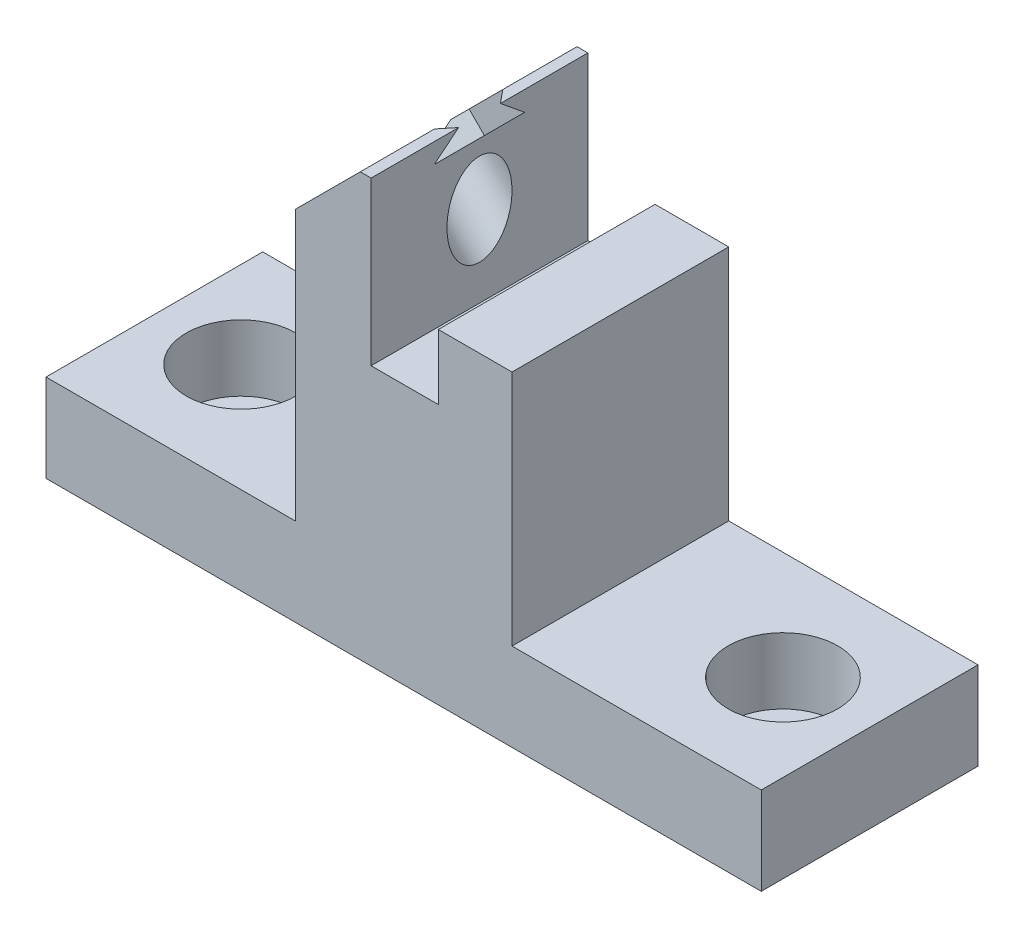
ISO-10303-21;
HEADER;
FILE_DESCRIPTION(('STEP AP214'),'2;1');
FILE_NAME('part.step','',(''),(''),'','','');
FILE_SCHEMA(('AUTOMOTIVE_DESIGN { 1 0 10303 214 1 1 1 1 }'));
ENDSEC;
DATA;
#1=APPLICATION_CONTEXT('core data for automotive mechanical design processes');
#2=APPLICATION_PROTOCOL_DEFINITION('international standard','automotive_design',2000,#1);
#3=PRODUCT_CONTEXT('',#1,'mechanical');
#4=PRODUCT('Part','Part','',(#3));
#5=PRODUCT_RELATED_PRODUCT_CATEGORY('part','',(#4));
#6=PRODUCT_DEFINITION_FORMATION('','',#4);
#7=PRODUCT_DEFINITION_CONTEXT('part definition',#1,'design');
#8=PRODUCT_DEFINITION('design','',#6,#7);
#9=PRODUCT_DEFINITION_SHAPE('','',#8);
#10=(LENGTH_UNIT() NAMED_UNIT(*) SI_UNIT(.MILLI.,.METRE.));
#11=(NAMED_UNIT(*) PLANE_ANGLE_UNIT() SI_UNIT($,.RADIAN.));
#12=(NAMED_UNIT(*) SI_UNIT($,.STERADIAN.) SOLID_ANGLE_UNIT());
#13=UNCERTAINTY_MEASURE_WITH_UNIT(LENGTH_MEASURE(1.E-05),#10,'distance_accuracy_value','');
#14=(GEOMETRIC_REPRESENTATION_CONTEXT(3) GLOBAL_UNCERTAINTY_ASSIGNED_CONTEXT((#13)) GLOBAL_UNIT_ASSIGNED_CONTEXT((#10,
#11,#12)) REPRESENTATION_CONTEXT('',''));
#15=CARTESIAN_POINT('',(0.,0.,0.));
#16=DIRECTION('',(0.,0.,1.));
#17=DIRECTION('',(1.,0.,0.));
#18=AXIS2_PLACEMENT_3D('',#15,#16,#17);
#19=CARTESIAN_POINT('',(-25.,21.001,0.));
#20=DIRECTION('',(0.,-1.,0.));
#21=DIRECTION('',(0.,0.,-1.));
#22=AXIS2_PLACEMENT_3D('',#19,#20,#21);
#23=CYLINDRICAL_SURFACE('',#22,3.);
#24=CARTESIAN_POINT('',(-25.,-18.,0.));
#25=DIRECTION('',(0.,1.,0.));
#26=DIRECTION('',(0.,0.,-1.));
#27=AXIS2_PLACEMENT_3D('',#24,#25,#26);
#28=CIRCLE('',#27,3.);
#29=CARTESIAN_POINT('',(-25.,-18.,-3.));
#30=VERTEX_POINT('',#29);
#31=EDGE_CURVE('E225',#30,#30,#28,.T.);
#32=ORIENTED_EDGE('',*,*,#31,.F.);
#33=EDGE_LOOP('',(#32));
#34=FACE_BOUND('',#33,.T.);
#35=CARTESIAN_POINT('',(-25.,-16.,0.));
#36=DIRECTION('',(0.,1.,0.));
#37=DIRECTION('',(0.,0.,1.));
#38=AXIS2_PLACEMENT_3D('',#35,#36,#37);
#39=CIRCLE('',#38,3.);
#40=CARTESIAN_POINT('',(-25.,-16.,3.));
#41=VERTEX_POINT('',#40);
#42=EDGE_CURVE('E43',#41,#41,#39,.T.);
#43=ORIENTED_EDGE('',*,*,#42,.T.);
#44=EDGE_LOOP('',(#43));
#45=FACE_BOUND('',#44,.T.);
#46=ADVANCED_FACE('F39',(#34,#45),#23,.F.);
#47=CARTESIAN_POINT('',(25.,21.001,0.));
#48=DIRECTION('',(0.,-1.,0.));
#49=DIRECTION('',(0.,0.,-1.));
#50=AXIS2_PLACEMENT_3D('',#47,#48,#49);
#51=CYLINDRICAL_SURFACE('',#50,3.);
#52=CARTESIAN_POINT('',(25.,-18.,0.));
#53=DIRECTION('',(0.,-1.,0.));
#54=DIRECTION('',(0.,0.,-1.));
#55=AXIS2_PLACEMENT_3D('',#52,#53,#54);
#56=CIRCLE('',#55,3.);
#57=CARTESIAN_POINT('',(25.,-18.,-3.));
#58=VERTEX_POINT('',#57);
#59=EDGE_CURVE('E236',#58,#58,#56,.T.);
#60=ORIENTED_EDGE('',*,*,#59,.T.);
#61=EDGE_LOOP('',(#60));
#62=FACE_BOUND('',#61,.T.);
#63=CARTESIAN_POINT('',(25.,-16.,0.));
#64=DIRECTION('',(0.,1.,0.));
#65=DIRECTION('',(0.,0.,1.));
#66=AXIS2_PLACEMENT_3D('',#63,#64,#65);
#67=CIRCLE('',#66,3.);
#68=CARTESIAN_POINT('',(25.,-16.,3.));
#69=VERTEX_POINT('',#68);
#70=EDGE_CURVE('E232',#69,#69,#67,.F.);
#71=ORIENTED_EDGE('',*,*,#70,.F.);
#72=EDGE_LOOP('',(#71));
#73=FACE_BOUND('',#72,.T.);
#74=ADVANCED_FACE('F450',(#62,#73),#51,.F.);
#75=CARTESIAN_POINT('',(10.,6.,10.));
#76=DIRECTION('',(-1.,0.,0.));
#77=DIRECTION('',(0.,0.,1.));
#78=AXIS2_PLACEMENT_3D('',#75,#76,#77);
#79=PLANE('',#78);
#80=DIRECTION('',(0.,0.,1.));
#81=VECTOR('',#80,1.);
#82=CARTESIAN_POINT('',(10.,-9.9,10.));
#83=LINE('',#82,#81);
#84=CARTESIAN_POINT('',(10.,-9.9,-10.));
#85=VERTEX_POINT('',#84);
#86=CARTESIAN_POINT('',(10.,-9.9,10.));
#87=VERTEX_POINT('',#86);
#88=EDGE_CURVE('E65',#85,#87,#83,.T.);
#89=ORIENTED_EDGE('',*,*,#88,.F.);
#90=DIRECTION('',(0.,-1.,0.));
#91=VECTOR('',#90,1.);
#92=CARTESIAN_POINT('',(10.,6.,-10.));
#93=LINE('',#92,#91);
#94=CARTESIAN_POINT('',(10.,12.,-10.));
#95=VERTEX_POINT('',#94);
#96=EDGE_CURVE('E427',#95,#85,#93,.T.);
#97=ORIENTED_EDGE('',*,*,#96,.F.);
#98=DIRECTION('',(0.,0.,-1.));
#99=VECTOR('',#98,1.);
#100=CARTESIAN_POINT('',(10.,12.,10.));
#101=LINE('',#100,#99);
#102=CARTESIAN_POINT('',(10.,12.,10.));
#103=VERTEX_POINT('',#102);
#104=EDGE_CURVE('E394',#103,#95,#101,.T.);
#105=ORIENTED_EDGE('',*,*,#104,.F.);
#106=DIRECTION('',(0.,-1.,0.));
#107=VECTOR('',#106,1.);
#108=CARTESIAN_POINT('',(10.,6.,10.));
#109=LINE('',#108,#107);
#110=EDGE_CURVE('E418',#103,#87,#109,.T.);
#111=ORIENTED_EDGE('',*,*,#110,.T.);
#112=EDGE_LOOP('',(#89,#97,#105,#111));
#113=FACE_BOUND('',#112,.T.);
#114=ADVANCED_FACE('F452',(#113),#79,.F.);
#115=CARTESIAN_POINT('',(0.,21.,0.));
#116=DIRECTION('',(0.,-1.,0.));
#117=DIRECTION('',(0.,0.,-1.));
#118=AXIS2_PLACEMENT_3D('',#115,#116,#117);
#119=PLANE('',#118);
#120=DIRECTION('',(0.,0.,-1.));
#121=VECTOR('',#120,1.);
#122=CARTESIAN_POINT('',(-3.,21.,10.));
#123=LINE('',#122,#121);
#124=CARTESIAN_POINT('',(-3.,21.,10.));
#125=VERTEX_POINT('',#124);
#126=CARTESIAN_POINT('',(-3.,21.,1.92808109443833));
#127=VERTEX_POINT('',#126);
#128=EDGE_CURVE('E366',#125,#127,#123,.T.);
#129=ORIENTED_EDGE('',*,*,#128,.T.);
#130=DIRECTION('',(-0.632455532033677,0.,0.774596669241483));
#131=VECTOR('',#130,1.);
#132=CARTESIAN_POINT('',(-0.85543702718383,21.,-0.698461407894577));
#133=LINE('',#132,#131);
#134=CARTESIAN_POINT('',(-4.00000000000001,21.,3.15282596582992));
#135=VERTEX_POINT('',#134);
#136=EDGE_CURVE('E343',#127,#135,#133,.T.);
#137=ORIENTED_EDGE('',*,*,#136,.T.);
#138=DIRECTION('',(0.,0.,1.));
#139=VECTOR('',#138,1.);
#140=CARTESIAN_POINT('',(-4.00000000000001,21.,0.));
#141=LINE('',#140,#139);
#142=CARTESIAN_POINT('',(-4.00000000000001,21.,10.));
#143=VERTEX_POINT('',#142);
#144=EDGE_CURVE('E430',#135,#143,#141,.T.);
#145=ORIENTED_EDGE('',*,*,#144,.T.);
#146=DIRECTION('',(1.,0.,0.));
#147=VECTOR('',#146,1.);
#148=CARTESIAN_POINT('',(-10.,21.,10.));
#149=LINE('',#148,#147);
#150=EDGE_CURVE('E362',#143,#125,#149,.T.);
#151=ORIENTED_EDGE('',*,*,#150,.T.);
#152=EDGE_LOOP('',(#129,#137,#145,#151));
#153=FACE_BOUND('',#152,.T.);
#154=ADVANCED_FACE('F459',(#153),#119,.F.);
#155=CARTESIAN_POINT('',(-4.00000000000001,21.,0.));
#156=DIRECTION('',(0.707106781186549,-0.707106781186546,0.));
#157=DIRECTION('',(0.,0.,1.));
#158=AXIS2_PLACEMENT_3D('',#155,#156,#157);
#159=PLANE('',#158);
#160=DIRECTION('',(0.353553390593273,0.353553390593274,-0.866025403784439));
#161=VECTOR('',#160,1.);
#162=CARTESIAN_POINT('',(-4.97864220139431,20.0213577986057,5.55));
#163=LINE('',#162,#161);
#164=CARTESIAN_POINT('',(-4.97864220139431,20.0213577986057,5.55));
#165=VERTEX_POINT('',#164);
#166=EDGE_CURVE('E264',#165,#135,#163,.T.);
#167=ORIENTED_EDGE('',*,*,#166,.F.);
#168=DIRECTION('',(0.707106781186546,0.707106781186549,0.));
#169=VECTOR('',#168,1.);
#170=CARTESIAN_POINT('',(-9.51019822554318,15.4898017744568,5.55));
#171=LINE('',#170,#169);
#172=CARTESIAN_POINT('',(-9.51019822554318,15.4898017744568,5.55));
#173=VERTEX_POINT('',#172);
#174=EDGE_CURVE('E270',#173,#165,#171,.T.);
#175=ORIENTED_EDGE('',*,*,#174,.F.);
#176=DIRECTION('',(0.353553390593273,0.353553390593274,0.866025403784439));
#177=VECTOR('',#176,1.);
#178=CARTESIAN_POINT('',(-11.7759762376176,13.2240237623824,0.));
#179=LINE('',#178,#177);
#180=CARTESIAN_POINT('',(-10.,15.,4.350235577471));
#181=VERTEX_POINT('',#180);
#182=EDGE_CURVE('E301',#181,#173,#179,.T.);
#183=ORIENTED_EDGE('',*,*,#182,.F.);
#184=DIRECTION('',(0.,0.,-1.));
#185=VECTOR('',#184,1.);
#186=CARTESIAN_POINT('',(-10.,15.,10.));
#187=LINE('',#186,#185);
#188=CARTESIAN_POINT('',(-10.,15.,10.));
#189=VERTEX_POINT('',#188);
#190=EDGE_CURVE('E49',#189,#181,#187,.T.);
#191=ORIENTED_EDGE('',*,*,#190,.F.);
#192=DIRECTION('',(0.707106781186546,0.707106781186549,0.));
#193=VECTOR('',#192,1.);
#194=CARTESIAN_POINT('',(-4.00000000000001,21.,10.));
#195=LINE('',#194,#193);
#196=EDGE_CURVE('E435',#143,#189,#195,.F.);
#197=ORIENTED_EDGE('',*,*,#196,.F.);
#198=ORIENTED_EDGE('',*,*,#144,.F.);
#199=EDGE_LOOP('',(#167,#175,#183,#191,#197,#198));
#200=FACE_BOUND('',#199,.T.);
#201=ADVANCED_FACE('F510',(#200),#159,.F.);
#202=CARTESIAN_POINT('',(-0.173352401603255,10.6845119746658,0.));
#203=DIRECTION('',(-0.707106781186549,0.707106781186546,0.));
#204=DIRECTION('',(-0.707106781186546,-0.707106781186549,0.));
#205=AXIS2_PLACEMENT_3D('',#202,#203,#204);
#206=CYLINDRICAL_SURFACE('',#205,3.);
#207=CARTESIAN_POINT('',(-3.,13.5111595730625,0.));
#208=DIRECTION('',(-1.,0.,0.));
#209=DIRECTION('',(0.,1.,0.));
#210=AXIS2_PLACEMENT_3D('',#207,#208,#209);
#211=ELLIPSE('',#210,4.24264068711928,3.);
#212=CARTESIAN_POINT('',(-3.,17.7538002601818,0.));
#213=VERTEX_POINT('',#212);
#214=EDGE_CURVE('E357',#213,#213,#211,.T.);
#215=ORIENTED_EDGE('',*,*,#214,.F.);
#216=EDGE_LOOP('',(#215));
#217=FACE_BOUND('',#216,.T.);
#218=CARTESIAN_POINT('',(-5.83020665109565,16.3413662241582,0.));
#219=DIRECTION('',(-0.707106781186549,0.707106781186546,0.));
#220=DIRECTION('',(-0.707106781186546,-0.707106781186549,0.));
#221=AXIS2_PLACEMENT_3D('',#218,#219,#220);
#222=CIRCLE('',#221,3.);
#223=CARTESIAN_POINT('',(-7.95152699465529,14.2200458805985,0.));
#224=VERTEX_POINT('',#223);
#225=EDGE_CURVE('E310',#224,#224,#222,.F.);
#226=ORIENTED_EDGE('',*,*,#225,.F.);
#227=EDGE_LOOP('',(#226));
#228=FACE_BOUND('',#227,.T.);
#229=ADVANCED_FACE('F506',(#217,#228),#206,.F.);
#230=CARTESIAN_POINT('',(0.,6.,0.));
#231=DIRECTION('',(0.,-1.,0.));
#232=DIRECTION('',(0.,0.,-1.));
#233=AXIS2_PLACEMENT_3D('',#230,#231,#232);
#234=PLANE('',#233);
#235=DIRECTION('',(0.,0.,-1.));
#236=VECTOR('',#235,1.);
#237=CARTESIAN_POINT('',(-3.,6.,10.));
#238=LINE('',#237,#236);
#239=CARTESIAN_POINT('',(-3.,6.,10.));
#240=VERTEX_POINT('',#239);
#241=CARTESIAN_POINT('',(-3.,6.,-10.));
#242=VERTEX_POINT('',#241);
#243=EDGE_CURVE('E361',#240,#242,#238,.T.);
#244=ORIENTED_EDGE('',*,*,#243,.F.);
#245=DIRECTION('',(1.,0.,0.));
#246=VECTOR('',#245,1.);
#247=CARTESIAN_POINT('',(-10.,6.,10.));
#248=LINE('',#247,#246);
#249=CARTESIAN_POINT('',(3.2,6.,10.));
#250=VERTEX_POINT('',#249);
#251=EDGE_CURVE('E415',#240,#250,#248,.T.);
#252=ORIENTED_EDGE('',*,*,#251,.T.);
#253=DIRECTION('',(0.,0.,1.));
#254=VECTOR('',#253,1.);
#255=CARTESIAN_POINT('',(3.2,6.,10.));
#256=LINE('',#255,#254);
#257=CARTESIAN_POINT('',(3.2,6.,-10.));
#258=VERTEX_POINT('',#257);
#259=EDGE_CURVE('E385',#258,#250,#256,.T.);
#260=ORIENTED_EDGE('',*,*,#259,.F.);
#261=DIRECTION('',(-1.,0.,0.));
#262=VECTOR('',#261,1.);
#263=CARTESIAN_POINT('',(-10.,6.,-10.));
#264=LINE('',#263,#262);
#265=EDGE_CURVE('E412',#258,#242,#264,.T.);
#266=ORIENTED_EDGE('',*,*,#265,.T.);
#267=EDGE_LOOP('',(#244,#252,#260,#266));
#268=FACE_BOUND('',#267,.T.);
#269=ADVANCED_FACE('F509',(#268),#234,.F.);
#270=CARTESIAN_POINT('',(-10.,6.,-10.));
#271=DIRECTION('',(0.,0.,1.));
#272=DIRECTION('',(1.,0.,0.));
#273=AXIS2_PLACEMENT_3D('',#270,#271,#272);
#274=PLANE('',#273);
#275=DIRECTION('',(0.,-1.,0.));
#276=VECTOR('',#275,1.);
#277=CARTESIAN_POINT('',(-10.,6.,-10.));
#278=LINE('',#277,#276);
#279=CARTESIAN_POINT('',(-10.,15.,-10.));
#280=VERTEX_POINT('',#279);
#281=CARTESIAN_POINT('',(-10.,-9.9,-10.));
#282=VERTEX_POINT('',#281);
#283=EDGE_CURVE('E423',#280,#282,#278,.T.);
#284=ORIENTED_EDGE('',*,*,#283,.F.);
#285=DIRECTION('',(-0.707106781186546,-0.707106781186549,0.));
#286=VECTOR('',#285,1.);
#287=CARTESIAN_POINT('',(-4.00000000000001,21.,-10.));
#288=LINE('',#287,#286);
#289=CARTESIAN_POINT('',(-4.00000000000001,21.,-10.));
#290=VERTEX_POINT('',#289);
#291=EDGE_CURVE('E11',#280,#290,#288,.F.);
#292=ORIENTED_EDGE('',*,*,#291,.T.);
#293=DIRECTION('',(-1.,0.,0.));
#294=VECTOR('',#293,1.);
#295=CARTESIAN_POINT('',(-10.,21.,-10.));
#296=LINE('',#295,#294);
#297=CARTESIAN_POINT('',(-3.,21.,-10.));
#298=VERTEX_POINT('',#297);
#299=EDGE_CURVE('E370',#298,#290,#296,.T.);
#300=ORIENTED_EDGE('',*,*,#299,.F.);
#301=DIRECTION('',(0.,-1.,0.));
#302=VECTOR('',#301,1.);
#303=CARTESIAN_POINT('',(-3.,21.,-10.));
#304=LINE('',#303,#302);
#305=EDGE_CURVE('E374',#298,#242,#304,.T.);
#306=ORIENTED_EDGE('',*,*,#305,.T.);
#307=ORIENTED_EDGE('',*,*,#265,.F.);
#308=DIRECTION('',(0.,-1.,0.));
#309=VECTOR('',#308,1.);
#310=CARTESIAN_POINT('',(3.2,12.,-10.));
#311=LINE('',#310,#309);
#312=CARTESIAN_POINT('',(3.2,12.,-10.));
#313=VERTEX_POINT('',#312);
#314=EDGE_CURVE('E401',#313,#258,#311,.T.);
#315=ORIENTED_EDGE('',*,*,#314,.F.);
#316=DIRECTION('',(-1.,0.,0.));
#317=VECTOR('',#316,1.);
#318=CARTESIAN_POINT('',(3.2,12.,-10.));
#319=LINE('',#318,#317);
#320=EDGE_CURVE('E398',#95,#313,#319,.T.);
#321=ORIENTED_EDGE('',*,*,#320,.F.);
#322=ORIENTED_EDGE('',*,*,#96,.T.);
#323=DIRECTION('',(-1.,0.,0.));
#324=VECTOR('',#323,1.);
#325=CARTESIAN_POINT('',(33.,-9.9,-10.));
#326=LINE('',#325,#324);
#327=CARTESIAN_POINT('',(33.,-9.9,-10.));
#328=VERTEX_POINT('',#327);
#329=EDGE_CURVE('E260',#328,#85,#326,.T.);
#330=ORIENTED_EDGE('',*,*,#329,.F.);
#331=DIRECTION('',(0.,1.,0.));
#332=VECTOR('',#331,1.);
#333=CARTESIAN_POINT('',(33.,-18.,-10.));
#334=LINE('',#333,#332);
#335=CARTESIAN_POINT('',(33.,-18.,-10.));
#336=VERTEX_POINT('',#335);
#337=EDGE_CURVE('E248',#336,#328,#334,.T.);
#338=ORIENTED_EDGE('',*,*,#337,.F.);
#339=DIRECTION('',(1.,0.,0.));
#340=VECTOR('',#339,1.);
#341=CARTESIAN_POINT('',(10.,-18.,-10.));
#342=LINE('',#341,#340);
#343=CARTESIAN_POINT('',(-33.,-18.,-10.));
#344=VERTEX_POINT('',#343);
#345=EDGE_CURVE('E351',#344,#336,#342,.T.);
#346=ORIENTED_EDGE('',*,*,#345,.F.);
#347=DIRECTION('',(0.,1.,0.));
#348=VECTOR('',#347,1.);
#349=CARTESIAN_POINT('',(-33.,-18.,-10.));
#350=LINE('',#349,#348);
#351=CARTESIAN_POINT('',(-33.,-9.9,-10.));
#352=VERTEX_POINT('',#351);
#353=EDGE_CURVE('E215',#344,#352,#350,.T.);
#354=ORIENTED_EDGE('',*,*,#353,.T.);
#355=DIRECTION('',(1.,0.,0.));
#356=VECTOR('',#355,1.);
#357=CARTESIAN_POINT('',(-33.,-9.9,-10.));
#358=LINE('',#357,#356);
#359=EDGE_CURVE('E200',#352,#282,#358,.T.);
#360=ORIENTED_EDGE('',*,*,#359,.T.);
#361=EDGE_LOOP('',(#284,#292,#300,#306,#307,#315,#321,#322,#330,#338,#346,#354,#360));
#362=FACE_BOUND('',#361,.T.);
#363=ADVANCED_FACE('F530',(#362),#274,.F.);
#364=CARTESIAN_POINT('',(-10.,6.,10.));
#365=DIRECTION('',(1.,0.,0.));
#366=DIRECTION('',(0.,0.,-1.));
#367=AXIS2_PLACEMENT_3D('',#364,#365,#366);
#368=PLANE('',#367);
#369=ORIENTED_EDGE('',*,*,#283,.T.);
#370=DIRECTION('',(0.,0.,1.));
#371=VECTOR('',#370,1.);
#372=CARTESIAN_POINT('',(-10.,-9.9,10.));
#373=LINE('',#372,#371);
#374=CARTESIAN_POINT('',(-10.,-9.9,10.));
#375=VERTEX_POINT('',#374);
#376=EDGE_CURVE('E211',#282,#375,#373,.T.);
#377=ORIENTED_EDGE('',*,*,#376,.T.);
#378=DIRECTION('',(0.,-1.,0.));
#379=VECTOR('',#378,1.);
#380=CARTESIAN_POINT('',(-10.,6.,10.));
#381=LINE('',#380,#379);
#382=EDGE_CURVE('E197',#189,#375,#381,.T.);
#383=ORIENTED_EDGE('',*,*,#382,.F.);
#384=ORIENTED_EDGE('',*,*,#190,.T.);
#385=DIRECTION('',(0.,-0.632455532033675,-0.774596669241484));
#386=VECTOR('',#385,1.);
#387=CARTESIAN_POINT('',(-10.,14.1678080004252,3.33101269397869));
#388=LINE('',#387,#386);
#389=CARTESIAN_POINT('',(-10.,12.1715728752538,0.886133962333245));
#390=VERTEX_POINT('',#389);
#391=EDGE_CURVE('E339',#181,#390,#388,.T.);
#392=ORIENTED_EDGE('',*,*,#391,.T.);
#393=DIRECTION('',(0.,0.,1.));
#394=VECTOR('',#393,1.);
#395=CARTESIAN_POINT('',(-10.,12.1715728752538,10.));
#396=LINE('',#395,#394);
#397=CARTESIAN_POINT('',(-10.,12.1715728752538,-0.886133962333247));
#398=VERTEX_POINT('',#397);
#399=EDGE_CURVE('E324',#398,#390,#396,.T.);
#400=ORIENTED_EDGE('',*,*,#399,.F.);
#401=DIRECTION('',(0.,0.632455532033675,-0.774596669241484));
#402=VECTOR('',#401,1.);
#403=CARTESIAN_POINT('',(-10.,4.36984902929251,8.66898730602132));
#404=LINE('',#403,#402);
#405=CARTESIAN_POINT('',(-10.,15.,-4.350235577471));
#406=VERTEX_POINT('',#405);
#407=EDGE_CURVE('E335',#398,#406,#404,.T.);
#408=ORIENTED_EDGE('',*,*,#407,.T.);
#409=EDGE_CURVE('E438',#406,#280,#187,.T.);
#410=ORIENTED_EDGE('',*,*,#409,.T.);
#411=EDGE_LOOP('',(#369,#377,#383,#384,#392,#400,#408,#410));
#412=FACE_BOUND('',#411,.T.);
#413=ADVANCED_FACE('F534',(#412),#368,.F.);
#414=CARTESIAN_POINT('',(-10.,6.,10.));
#415=DIRECTION('',(0.,0.,-1.));
#416=DIRECTION('',(-1.,0.,0.));
#417=AXIS2_PLACEMENT_3D('',#414,#415,#416);
#418=PLANE('',#417);
#419=ORIENTED_EDGE('',*,*,#150,.F.);
#420=ORIENTED_EDGE('',*,*,#196,.T.);
#421=ORIENTED_EDGE('',*,*,#382,.T.);
#422=DIRECTION('',(1.,0.,0.));
#423=VECTOR('',#422,1.);
#424=CARTESIAN_POINT('',(-33.,-9.9,10.));
#425=LINE('',#424,#423);
#426=CARTESIAN_POINT('',(-33.,-9.9,10.));
#427=VERTEX_POINT('',#426);
#428=EDGE_CURVE('E57',#427,#375,#425,.T.);
#429=ORIENTED_EDGE('',*,*,#428,.F.);
#430=DIRECTION('',(0.,-1.,0.));
#431=VECTOR('',#430,1.);
#432=CARTESIAN_POINT('',(-33.,-18.,10.));
#433=LINE('',#432,#431);
#434=CARTESIAN_POINT('',(-33.,-18.,10.));
#435=VERTEX_POINT('',#434);
#436=EDGE_CURVE('E194',#427,#435,#433,.T.);
#437=ORIENTED_EDGE('',*,*,#436,.T.);
#438=DIRECTION('',(-1.,0.,0.));
#439=VECTOR('',#438,1.);
#440=CARTESIAN_POINT('',(10.,-18.,10.));
#441=LINE('',#440,#439);
#442=CARTESIAN_POINT('',(33.,-18.,10.));
#443=VERTEX_POINT('',#442);
#444=EDGE_CURVE('E354',#443,#435,#441,.T.);
#445=ORIENTED_EDGE('',*,*,#444,.F.);
#446=DIRECTION('',(0.,-1.,0.));
#447=VECTOR('',#446,1.);
#448=CARTESIAN_POINT('',(33.,-18.,10.));
#449=LINE('',#448,#447);
#450=CARTESIAN_POINT('',(33.,-9.9,10.));
#451=VERTEX_POINT('',#450);
#452=EDGE_CURVE('E240',#451,#443,#449,.T.);
#453=ORIENTED_EDGE('',*,*,#452,.F.);
#454=DIRECTION('',(-1.,0.,0.));
#455=VECTOR('',#454,1.);
#456=CARTESIAN_POINT('',(33.,-9.9,10.));
#457=LINE('',#456,#455);
#458=EDGE_CURVE('E254',#451,#87,#457,.T.);
#459=ORIENTED_EDGE('',*,*,#458,.T.);
#460=ORIENTED_EDGE('',*,*,#110,.F.);
#461=DIRECTION('',(1.,0.,0.));
#462=VECTOR('',#461,1.);
#463=CARTESIAN_POINT('',(3.2,12.,10.));
#464=LINE('',#463,#462);
#465=CARTESIAN_POINT('',(3.2,12.,10.));
#466=VERTEX_POINT('',#465);
#467=EDGE_CURVE('E390',#466,#103,#464,.T.);
#468=ORIENTED_EDGE('',*,*,#467,.F.);
#469=DIRECTION('',(0.,-1.,0.));
#470=VECTOR('',#469,1.);
#471=CARTESIAN_POINT('',(3.2,12.,10.));
#472=LINE('',#471,#470);
#473=EDGE_CURVE('E408',#466,#250,#472,.T.);
#474=ORIENTED_EDGE('',*,*,#473,.T.);
#475=ORIENTED_EDGE('',*,*,#251,.F.);
#476=DIRECTION('',(0.,-1.,0.));
#477=VECTOR('',#476,1.);
#478=CARTESIAN_POINT('',(-3.,21.,10.));
#479=LINE('',#478,#477);
#480=EDGE_CURVE('E381',#125,#240,#479,.T.);
#481=ORIENTED_EDGE('',*,*,#480,.F.);
#482=EDGE_LOOP('',(#419,#420,#421,#429,#437,#445,#453,#459,#460,#468,#474,#475,#481));
#483=FACE_BOUND('',#482,.T.);
#484=ADVANCED_FACE('F193',(#483),#418,.F.);
#485=CARTESIAN_POINT('',(3.2,12.,10.));
#486=DIRECTION('',(1.,0.,0.));
#487=DIRECTION('',(0.,0.,-1.));
#488=AXIS2_PLACEMENT_3D('',#485,#486,#487);
#489=PLANE('',#488);
#490=ORIENTED_EDGE('',*,*,#259,.T.);
#491=ORIENTED_EDGE('',*,*,#473,.F.);
#492=DIRECTION('',(0.,0.,1.));
#493=VECTOR('',#492,1.);
#494=CARTESIAN_POINT('',(3.2,12.,10.));
#495=LINE('',#494,#493);
#496=EDGE_CURVE('E386',#313,#466,#495,.T.);
#497=ORIENTED_EDGE('',*,*,#496,.F.);
#498=ORIENTED_EDGE('',*,*,#314,.T.);
#499=EDGE_LOOP('',(#490,#491,#497,#498));
#500=FACE_BOUND('',#499,.T.);
#501=ADVANCED_FACE('F523',(#500),#489,.F.);
#502=CARTESIAN_POINT('',(0.,12.,0.));
#503=DIRECTION('',(0.,-1.,0.));
#504=DIRECTION('',(0.,0.,-1.));
#505=AXIS2_PLACEMENT_3D('',#502,#503,#504);
#506=PLANE('',#505);
#507=ORIENTED_EDGE('',*,*,#496,.T.);
#508=ORIENTED_EDGE('',*,*,#467,.T.);
#509=ORIENTED_EDGE('',*,*,#104,.T.);
#510=ORIENTED_EDGE('',*,*,#320,.T.);
#511=EDGE_LOOP('',(#507,#508,#509,#510));
#512=FACE_BOUND('',#511,.T.);
#513=ADVANCED_FACE('F519',(#512),#506,.F.);
#514=CARTESIAN_POINT('',(-3.,21.,10.));
#515=DIRECTION('',(-1.,0.,0.));
#516=DIRECTION('',(0.,0.,1.));
#517=AXIS2_PLACEMENT_3D('',#514,#515,#516);
#518=PLANE('',#517);
#519=ORIENTED_EDGE('',*,*,#214,.T.);
#520=EDGE_LOOP('',(#519));
#521=FACE_BOUND('',#520,.T.);
#522=DIRECTION('',(0.,0.,-1.));
#523=VECTOR('',#522,1.);
#524=CARTESIAN_POINT('',(-3.,19.1715728752538,10.));
#525=LINE('',#524,#523);
#526=CARTESIAN_POINT('',(-3.,19.1715728752538,4.16743783818448));
#527=VERTEX_POINT('',#526);
#528=CARTESIAN_POINT('',(-3.,19.1715728752538,-4.16743783818448));
#529=VERTEX_POINT('',#528);
#530=EDGE_CURVE('E321',#527,#529,#525,.T.);
#531=ORIENTED_EDGE('',*,*,#530,.F.);
#532=DIRECTION('',(0.,0.632455532033675,-0.774596669241484));
#533=VECTOR('',#532,1.);
#534=CARTESIAN_POINT('',(-3.,17.0455834872498,6.77123243777534));
#535=LINE('',#534,#533);
#536=EDGE_CURVE('E347',#527,#127,#535,.T.);
#537=ORIENTED_EDGE('',*,*,#536,.T.);
#538=ORIENTED_EDGE('',*,*,#128,.F.);
#539=ORIENTED_EDGE('',*,*,#480,.T.);
#540=ORIENTED_EDGE('',*,*,#243,.T.);
#541=ORIENTED_EDGE('',*,*,#305,.F.);
#542=CARTESIAN_POINT('',(-3.,21.,-1.92808109443833));
#543=VERTEX_POINT('',#542);
#544=EDGE_CURVE('E365',#543,#298,#123,.T.);
#545=ORIENTED_EDGE('',*,*,#544,.F.);
#546=DIRECTION('',(0.,-0.632455532033676,-0.774596669241484));
#547=VECTOR('',#546,1.);
#548=CARTESIAN_POINT('',(-3.,26.8435424583825,5.22876756222467));
#549=LINE('',#548,#547);
#550=EDGE_CURVE('E331',#543,#529,#549,.T.);
#551=ORIENTED_EDGE('',*,*,#550,.T.);
#552=EDGE_LOOP('',(#531,#537,#538,#539,#540,#541,#545,#551));
#553=FACE_BOUND('',#552,.T.);
#554=ADVANCED_FACE('F515',(#521,#553),#518,.F.);
#555=CARTESIAN_POINT('',(-4.00000000000001,21.,-3.15282596582992));
#556=VERTEX_POINT('',#555);
#557=EDGE_CURVE('E431',#290,#556,#141,.T.);
#558=ORIENTED_EDGE('',*,*,#557,.T.);
#559=DIRECTION('',(0.632455532033677,0.,0.774596669241483));
#560=VECTOR('',#559,1.);
#561=CARTESIAN_POINT('',(-0.855437027183828,21.,0.698461407894576));
#562=LINE('',#561,#560);
#563=EDGE_CURVE('E327',#556,#543,#562,.T.);
#564=ORIENTED_EDGE('',*,*,#563,.T.);
#565=ORIENTED_EDGE('',*,*,#544,.T.);
#566=ORIENTED_EDGE('',*,*,#299,.T.);
#567=EDGE_LOOP('',(#558,#564,#565,#566));
#568=FACE_BOUND('',#567,.T.);
#569=ADVANCED_FACE('F512',(#568),#119,.F.);
#570=DIRECTION('',(-0.353553390593273,-0.353553390593274,0.866025403784439));
#571=VECTOR('',#570,1.);
#572=CARTESIAN_POINT('',(-9.51019822554318,15.4898017744568,-5.55));
#573=LINE('',#572,#571);
#574=CARTESIAN_POINT('',(-9.51019822554318,15.4898017744568,-5.55));
#575=VERTEX_POINT('',#574);
#576=EDGE_CURVE('E298',#575,#406,#573,.T.);
#577=ORIENTED_EDGE('',*,*,#576,.F.);
#578=DIRECTION('',(-0.707106781186546,-0.707106781186549,0.));
#579=VECTOR('',#578,1.);
#580=CARTESIAN_POINT('',(-4.97864220139431,20.0213577986057,-5.55));
#581=LINE('',#580,#579);
#582=CARTESIAN_POINT('',(-4.97864220139431,20.0213577986057,-5.55));
#583=VERTEX_POINT('',#582);
#584=EDGE_CURVE('E294',#583,#575,#581,.T.);
#585=ORIENTED_EDGE('',*,*,#584,.F.);
#586=DIRECTION('',(-0.353553390593273,-0.353553390593275,-0.866025403784439));
#587=VECTOR('',#586,1.);
#588=CARTESIAN_POINT('',(-2.71286418931987,22.2871358106801,0.));
#589=LINE('',#588,#587);
#590=EDGE_CURVE('E291',#556,#583,#589,.T.);
#591=ORIENTED_EDGE('',*,*,#590,.F.);
#592=ORIENTED_EDGE('',*,*,#557,.F.);
#593=ORIENTED_EDGE('',*,*,#291,.F.);
#594=ORIENTED_EDGE('',*,*,#409,.F.);
#595=EDGE_LOOP('',(#577,#585,#591,#592,#593,#594));
#596=FACE_BOUND('',#595,.T.);
#597=ADVANCED_FACE('F41',(#596),#159,.F.);
#598=CARTESIAN_POINT('',(0.,-18.,0.));
#599=DIRECTION('',(0.,-1.,0.));
#600=DIRECTION('',(0.,0.,-1.));
#601=AXIS2_PLACEMENT_3D('',#598,#599,#600);
#602=PLANE('',#601);
#603=ORIENTED_EDGE('',*,*,#31,.T.);
#604=EDGE_LOOP('',(#603));
#605=FACE_BOUND('',#604,.T.);
#606=ORIENTED_EDGE('',*,*,#59,.F.);
#607=EDGE_LOOP('',(#606));
#608=FACE_BOUND('',#607,.T.);
#609=ORIENTED_EDGE('',*,*,#444,.T.);
#610=DIRECTION('',(0.,0.,-1.));
#611=VECTOR('',#610,1.);
#612=CARTESIAN_POINT('',(-33.,-18.,10.));
#613=LINE('',#612,#611);
#614=EDGE_CURVE('E209',#435,#344,#613,.T.);
#615=ORIENTED_EDGE('',*,*,#614,.T.);
#616=ORIENTED_EDGE('',*,*,#345,.T.);
#617=DIRECTION('',(0.,0.,-1.));
#618=VECTOR('',#617,1.);
#619=CARTESIAN_POINT('',(33.,-18.,10.));
#620=LINE('',#619,#618);
#621=EDGE_CURVE('E244',#443,#336,#620,.T.);
#622=ORIENTED_EDGE('',*,*,#621,.F.);
#623=EDGE_LOOP('',(#609,#615,#616,#622));
#624=FACE_BOUND('',#623,.T.);
#625=ADVANCED_FACE('F501',(#605,#608,#624),#602,.T.);
#626=CARTESIAN_POINT('',(-3.56442863902121,18.6071442362326,5.55));
#627=DIRECTION('',(0.612372435695793,0.612372435695796,0.5));
#628=DIRECTION('',(-0.707106781186549,0.707106781186546,0.));
#629=AXIS2_PLACEMENT_3D('',#626,#627,#628);
#630=PLANE('',#629);
#631=DIRECTION('',(0.353553390593273,0.353553390593274,-0.866025403784439));
#632=VECTOR('',#631,1.);
#633=CARTESIAN_POINT('',(-3.56442863902121,18.6071442362326,5.55));
#634=LINE('',#633,#632);
#635=CARTESIAN_POINT('',(-3.56442863902121,18.6071442362326,5.55));
#636=VERTEX_POINT('',#635);
#637=EDGE_CURVE('E265',#636,#527,#634,.T.);
#638=ORIENTED_EDGE('',*,*,#637,.F.);
#639=DIRECTION('',(-0.707106781186549,0.707106781186546,0.));
#640=VECTOR('',#639,1.);
#641=CARTESIAN_POINT('',(-3.56442863902121,18.6071442362326,5.55));
#642=LINE('',#641,#640);
#643=EDGE_CURVE('E307',#636,#165,#642,.T.);
#644=ORIENTED_EDGE('',*,*,#643,.T.);
#645=ORIENTED_EDGE('',*,*,#166,.T.);
#646=ORIENTED_EDGE('',*,*,#136,.F.);
#647=ORIENTED_EDGE('',*,*,#536,.F.);
#648=EDGE_LOOP('',(#638,#644,#645,#646,#647));
#649=FACE_BOUND('',#648,.T.);
#650=ADVANCED_FACE('F488',(#649),#630,.F.);
#651=CARTESIAN_POINT('',(-10.3617626752445,11.8098102000093,0.));
#652=DIRECTION('',(-0.612372435695793,-0.612372435695796,0.5));
#653=DIRECTION('',(0.707106781186549,-0.707106781186546,0.));
#654=AXIS2_PLACEMENT_3D('',#651,#652,#653);
#655=PLANE('',#654);
#656=ORIENTED_EDGE('',*,*,#182,.T.);
#657=DIRECTION('',(-0.707106781186549,0.707106781186546,0.));
#658=VECTOR('',#657,1.);
#659=CARTESIAN_POINT('',(-8.09598466317008,14.0755882120837,5.55));
#660=LINE('',#659,#658);
#661=CARTESIAN_POINT('',(-8.09598466317008,14.0755882120837,5.55));
#662=VERTEX_POINT('',#661);
#663=EDGE_CURVE('E311',#662,#173,#660,.T.);
#664=ORIENTED_EDGE('',*,*,#663,.F.);
#665=DIRECTION('',(0.353553390593273,0.353553390593274,0.866025403784439));
#666=VECTOR('',#665,1.);
#667=CARTESIAN_POINT('',(-10.3617626752445,11.8098102000093,0.));
#668=LINE('',#667,#666);
#669=EDGE_CURVE('E281',#390,#662,#668,.T.);
#670=ORIENTED_EDGE('',*,*,#669,.F.);
#671=ORIENTED_EDGE('',*,*,#391,.F.);
#672=EDGE_LOOP('',(#656,#664,#670,#671));
#673=FACE_BOUND('',#672,.T.);
#674=ADVANCED_FACE('F484',(#673),#655,.F.);
#675=CARTESIAN_POINT('',(-8.09598466317008,14.0755882120837,-5.55));
#676=DIRECTION('',(-0.612372435695793,-0.612372435695796,-0.5));
#677=DIRECTION('',(0.707106781186549,-0.707106781186546,0.));
#678=AXIS2_PLACEMENT_3D('',#675,#676,#677);
#679=PLANE('',#678);
#680=DIRECTION('',(-0.353553390593273,-0.353553390593274,0.866025403784439));
#681=VECTOR('',#680,1.);
#682=CARTESIAN_POINT('',(-8.09598466317008,14.0755882120837,-5.55));
#683=LINE('',#682,#681);
#684=CARTESIAN_POINT('',(-8.09598466317008,14.0755882120837,-5.55));
#685=VERTEX_POINT('',#684);
#686=EDGE_CURVE('E277',#685,#398,#683,.T.);
#687=ORIENTED_EDGE('',*,*,#686,.F.);
#688=DIRECTION('',(-0.707106781186549,0.707106781186546,0.));
#689=VECTOR('',#688,1.);
#690=CARTESIAN_POINT('',(-8.09598466317008,14.0755882120837,-5.55));
#691=LINE('',#690,#689);
#692=EDGE_CURVE('E315',#685,#575,#691,.T.);
#693=ORIENTED_EDGE('',*,*,#692,.T.);
#694=ORIENTED_EDGE('',*,*,#576,.T.);
#695=ORIENTED_EDGE('',*,*,#407,.F.);
#696=EDGE_LOOP('',(#687,#693,#694,#695));
#697=FACE_BOUND('',#696,.T.);
#698=ADVANCED_FACE('F487',(#697),#679,.F.);
#699=CARTESIAN_POINT('',(-1.29865062694677,20.8729222483071,0.));
#700=DIRECTION('',(0.612372435695793,0.612372435695795,-0.5));
#701=DIRECTION('',(-0.707106781186549,0.707106781186546,0.));
#702=AXIS2_PLACEMENT_3D('',#699,#700,#701);
#703=PLANE('',#702);
#704=ORIENTED_EDGE('',*,*,#563,.F.);
#705=ORIENTED_EDGE('',*,*,#590,.T.);
#706=DIRECTION('',(-0.707106781186549,0.707106781186546,0.));
#707=VECTOR('',#706,1.);
#708=CARTESIAN_POINT('',(-3.56442863902121,18.6071442362326,-5.55));
#709=LINE('',#708,#707);
#710=CARTESIAN_POINT('',(-3.56442863902121,18.6071442362326,-5.55));
#711=VERTEX_POINT('',#710);
#712=EDGE_CURVE('E288',#711,#583,#709,.T.);
#713=ORIENTED_EDGE('',*,*,#712,.F.);
#714=DIRECTION('',(-0.353553390593273,-0.353553390593275,-0.866025403784439));
#715=VECTOR('',#714,1.);
#716=CARTESIAN_POINT('',(-1.29865062694677,20.8729222483071,0.));
#717=LINE('',#716,#715);
#718=EDGE_CURVE('E269',#529,#711,#717,.T.);
#719=ORIENTED_EDGE('',*,*,#718,.F.);
#720=ORIENTED_EDGE('',*,*,#550,.F.);
#721=EDGE_LOOP('',(#704,#705,#713,#719,#720));
#722=FACE_BOUND('',#721,.T.);
#723=ADVANCED_FACE('F479',(#722),#703,.F.);
#724=CARTESIAN_POINT('',(-11.0857864376269,11.0857864376269,0.));
#725=DIRECTION('',(-0.707106781186549,0.707106781186546,0.));
#726=DIRECTION('',(-0.707106781186546,-0.707106781186549,0.));
#727=AXIS2_PLACEMENT_3D('',#724,#725,#726);
#728=PLANE('',#727);
#729=ORIENTED_EDGE('',*,*,#225,.T.);
#730=EDGE_LOOP('',(#729));
#731=FACE_BOUND('',#730,.T.);
#732=ORIENTED_EDGE('',*,*,#399,.T.);
#733=ORIENTED_EDGE('',*,*,#669,.T.);
#734=DIRECTION('',(0.707106781186546,0.707106781186549,0.));
#735=VECTOR('',#734,1.);
#736=CARTESIAN_POINT('',(-8.09598466317008,14.0755882120837,5.55));
#737=LINE('',#736,#735);
#738=EDGE_CURVE('E284',#662,#636,#737,.T.);
#739=ORIENTED_EDGE('',*,*,#738,.T.);
#740=ORIENTED_EDGE('',*,*,#637,.T.);
#741=ORIENTED_EDGE('',*,*,#530,.T.);
#742=ORIENTED_EDGE('',*,*,#718,.T.);
#743=DIRECTION('',(-0.707106781186546,-0.707106781186549,0.));
#744=VECTOR('',#743,1.);
#745=CARTESIAN_POINT('',(-3.56442863902121,18.6071442362326,-5.55));
#746=LINE('',#745,#744);
#747=EDGE_CURVE('E273',#711,#685,#746,.T.);
#748=ORIENTED_EDGE('',*,*,#747,.T.);
#749=ORIENTED_EDGE('',*,*,#686,.T.);
#750=EDGE_LOOP('',(#732,#733,#739,#740,#741,#742,#748,#749));
#751=FACE_BOUND('',#750,.T.);
#752=ADVANCED_FACE('F475',(#731,#751),#728,.T.);
#753=CARTESIAN_POINT('',(-8.09598466317008,14.0755882120837,5.55));
#754=DIRECTION('',(0.,0.,1.));
#755=DIRECTION('',(0.,-1.,0.));
#756=AXIS2_PLACEMENT_3D('',#753,#754,#755);
#757=PLANE('',#756);
#758=ORIENTED_EDGE('',*,*,#174,.T.);
#759=ORIENTED_EDGE('',*,*,#643,.F.);
#760=ORIENTED_EDGE('',*,*,#738,.F.);
#761=ORIENTED_EDGE('',*,*,#663,.T.);
#762=EDGE_LOOP('',(#758,#759,#760,#761));
#763=FACE_BOUND('',#762,.T.);
#764=ADVANCED_FACE('F478',(#763),#757,.F.);
#765=CARTESIAN_POINT('',(-3.56442863902121,18.6071442362326,-5.55));
#766=DIRECTION('',(0.,0.,-1.));
#767=DIRECTION('',(-1.,0.,0.));
#768=AXIS2_PLACEMENT_3D('',#765,#766,#767);
#769=PLANE('',#768);
#770=ORIENTED_EDGE('',*,*,#584,.T.);
#771=ORIENTED_EDGE('',*,*,#692,.F.);
#772=ORIENTED_EDGE('',*,*,#747,.F.);
#773=ORIENTED_EDGE('',*,*,#712,.T.);
#774=EDGE_LOOP('',(#770,#771,#772,#773));
#775=FACE_BOUND('',#774,.T.);
#776=ADVANCED_FACE('F473',(#775),#769,.F.);
#777=CARTESIAN_POINT('',(33.,-9.9,10.));
#778=DIRECTION('',(0.,-1.,0.));
#779=DIRECTION('',(0.,0.,-1.));
#780=AXIS2_PLACEMENT_3D('',#777,#778,#779);
#781=PLANE('',#780);
#782=CARTESIAN_POINT('',(25.,-9.9,0.));
#783=DIRECTION('',(0.,1.,0.));
#784=DIRECTION('',(0.,0.,1.));
#785=AXIS2_PLACEMENT_3D('',#782,#783,#784);
#786=CIRCLE('',#785,5.05);
#787=CARTESIAN_POINT('',(25.,-9.9,5.05));
#788=VERTEX_POINT('',#787);
#789=EDGE_CURVE('E199',#788,#788,#786,.T.);
#790=ORIENTED_EDGE('',*,*,#789,.F.);
#791=EDGE_LOOP('',(#790));
#792=FACE_BOUND('',#791,.T.);
#793=ORIENTED_EDGE('',*,*,#88,.T.);
#794=ORIENTED_EDGE('',*,*,#458,.F.);
#795=DIRECTION('',(0.,0.,1.));
#796=VECTOR('',#795,1.);
#797=CARTESIAN_POINT('',(33.,-9.9,10.));
#798=LINE('',#797,#796);
#799=EDGE_CURVE('E251',#328,#451,#798,.T.);
#800=ORIENTED_EDGE('',*,*,#799,.F.);
#801=ORIENTED_EDGE('',*,*,#329,.T.);
#802=EDGE_LOOP('',(#793,#794,#800,#801));
#803=FACE_BOUND('',#802,.T.);
#804=ADVANCED_FACE('F469',(#792,#803),#781,.F.);
#805=CARTESIAN_POINT('',(33.,0.,0.));
#806=DIRECTION('',(-1.,0.,0.));
#807=DIRECTION('',(0.,0.,1.));
#808=AXIS2_PLACEMENT_3D('',#805,#806,#807);
#809=PLANE('',#808);
#810=ORIENTED_EDGE('',*,*,#452,.T.);
#811=ORIENTED_EDGE('',*,*,#621,.T.);
#812=ORIENTED_EDGE('',*,*,#337,.T.);
#813=ORIENTED_EDGE('',*,*,#799,.T.);
#814=EDGE_LOOP('',(#810,#811,#812,#813));
#815=FACE_BOUND('',#814,.T.);
#816=ADVANCED_FACE('F466',(#815),#809,.F.);
#817=CARTESIAN_POINT('',(25.,-16.,0.));
#818=DIRECTION('',(0.,1.,0.));
#819=DIRECTION('',(0.,0.,1.));
#820=AXIS2_PLACEMENT_3D('',#817,#818,#819);
#821=PLANE('',#820);
#822=CARTESIAN_POINT('',(25.,-16.,0.));
#823=DIRECTION('',(0.,1.,0.));
#824=DIRECTION('',(0.,0.,1.));
#825=AXIS2_PLACEMENT_3D('',#822,#823,#824);
#826=CIRCLE('',#825,5.05);
#827=CARTESIAN_POINT('',(25.,-16.,5.05));
#828=VERTEX_POINT('',#827);
#829=EDGE_CURVE('E228',#828,#828,#826,.T.);
#830=ORIENTED_EDGE('',*,*,#829,.T.);
#831=EDGE_LOOP('',(#830));
#832=FACE_BOUND('',#831,.T.);
#833=ORIENTED_EDGE('',*,*,#70,.T.);
#834=EDGE_LOOP('',(#833));
#835=FACE_BOUND('',#834,.T.);
#836=ADVANCED_FACE('F448',(#832,#835),#821,.T.);
#837=CARTESIAN_POINT('',(25.,-16.,0.));
#838=DIRECTION('',(0.,1.,0.));
#839=DIRECTION('',(0.,0.,1.));
#840=AXIS2_PLACEMENT_3D('',#837,#838,#839);
#841=CYLINDRICAL_SURFACE('',#840,5.05);
#842=ORIENTED_EDGE('',*,*,#829,.F.);
#843=EDGE_LOOP('',(#842));
#844=FACE_BOUND('',#843,.T.);
#845=ORIENTED_EDGE('',*,*,#789,.T.);
#846=EDGE_LOOP('',(#845));
#847=FACE_BOUND('',#846,.T.);
#848=ADVANCED_FACE('F464',(#844,#847),#841,.F.);
#849=CARTESIAN_POINT('',(-33.,-9.9,10.));
#850=DIRECTION('',(0.,1.,0.));
#851=DIRECTION('',(0.,0.,1.));
#852=AXIS2_PLACEMENT_3D('',#849,#850,#851);
#853=PLANE('',#852);
#854=CARTESIAN_POINT('',(-25.,-9.9,0.));
#855=DIRECTION('',(0.,-1.,0.));
#856=DIRECTION('',(0.,0.,1.));
#857=AXIS2_PLACEMENT_3D('',#854,#855,#856);
#858=CIRCLE('',#857,5.05);
#859=CARTESIAN_POINT('',(-25.,-9.9,5.05));
#860=VERTEX_POINT('',#859);
#861=EDGE_CURVE('E850',#860,#860,#858,.T.);
#862=ORIENTED_EDGE('',*,*,#861,.T.);
#863=EDGE_LOOP('',(#862));
#864=FACE_BOUND('',#863,.T.);
#865=ORIENTED_EDGE('',*,*,#376,.F.);
#866=ORIENTED_EDGE('',*,*,#359,.F.);
#867=DIRECTION('',(0.,0.,1.));
#868=VECTOR('',#867,1.);
#869=CARTESIAN_POINT('',(-33.,-9.9,10.));
#870=LINE('',#869,#868);
#871=EDGE_CURVE('E206',#352,#427,#870,.T.);
#872=ORIENTED_EDGE('',*,*,#871,.T.);
#873=ORIENTED_EDGE('',*,*,#428,.T.);
#874=EDGE_LOOP('',(#865,#866,#872,#873));
#875=FACE_BOUND('',#874,.T.);
#876=ADVANCED_FACE('F213',(#864,#875),#853,.T.);
#877=CARTESIAN_POINT('',(-33.,0.,0.));
#878=DIRECTION('',(1.,0.,0.));
#879=DIRECTION('',(0.,0.,1.));
#880=AXIS2_PLACEMENT_3D('',#877,#878,#879);
#881=PLANE('',#880);
#882=ORIENTED_EDGE('',*,*,#436,.F.);
#883=ORIENTED_EDGE('',*,*,#871,.F.);
#884=ORIENTED_EDGE('',*,*,#353,.F.);
#885=ORIENTED_EDGE('',*,*,#614,.F.);
#886=EDGE_LOOP('',(#882,#883,#884,#885));
#887=FACE_BOUND('',#886,.T.);
#888=ADVANCED_FACE('F204',(#887),#881,.F.);
#889=CARTESIAN_POINT('',(-25.,-16.,0.));
#890=DIRECTION('',(0.,1.,0.));
#891=DIRECTION('',(0.,0.,1.));
#892=AXIS2_PLACEMENT_3D('',#889,#890,#891);
#893=CYLINDRICAL_SURFACE('',#892,5.05);
#894=CARTESIAN_POINT('',(-25.,-16.,0.));
#895=DIRECTION('',(0.,-1.,0.));
#896=DIRECTION('',(0.,0.,1.));
#897=AXIS2_PLACEMENT_3D('',#894,#895,#896);
#898=CIRCLE('',#897,5.05);
#899=CARTESIAN_POINT('',(-25.,-16.,5.05));
#900=VERTEX_POINT('',#899);
#901=EDGE_CURVE('E848',#900,#900,#898,.T.);
#902=ORIENTED_EDGE('',*,*,#901,.T.);
#903=EDGE_LOOP('',(#902));
#904=FACE_BOUND('',#903,.T.);
#905=ORIENTED_EDGE('',*,*,#861,.F.);
#906=EDGE_LOOP('',(#905));
#907=FACE_BOUND('',#906,.T.);
#908=ADVANCED_FACE('F670',(#904,#907),#893,.F.);
#909=CARTESIAN_POINT('',(-25.,-16.,0.));
#910=DIRECTION('',(0.,1.,0.));
#911=DIRECTION('',(0.,0.,1.));
#912=AXIS2_PLACEMENT_3D('',#909,#910,#911);
#913=PLANE('',#912);
#914=ORIENTED_EDGE('',*,*,#42,.F.);
#915=EDGE_LOOP('',(#914));
#916=FACE_BOUND('',#915,.T.);
#917=ORIENTED_EDGE('',*,*,#901,.F.);
#918=EDGE_LOOP('',(#917));
#919=FACE_BOUND('',#918,.T.);
#920=ADVANCED_FACE('F677',(#916,#919),#913,.T.);
#921=CLOSED_SHELL('',(#46,#74,#114,#154,#201,#229,#269,#363,#413,#484,#501,#513,#554,#569,#597,
#625,#650,#674,#698,#723,#752,#764,#776,#804,#816,#836,#848,#876,#888,#908,#920));
#922=MANIFOLD_SOLID_BREP('B2',#921);
#923=ADVANCED_BREP_SHAPE_REPRESENTATION('',(#18,#922),#14);
#924=SHAPE_DEFINITION_REPRESENTATION(#9,#923);
ENDSEC;
END-ISO-10303-21;
